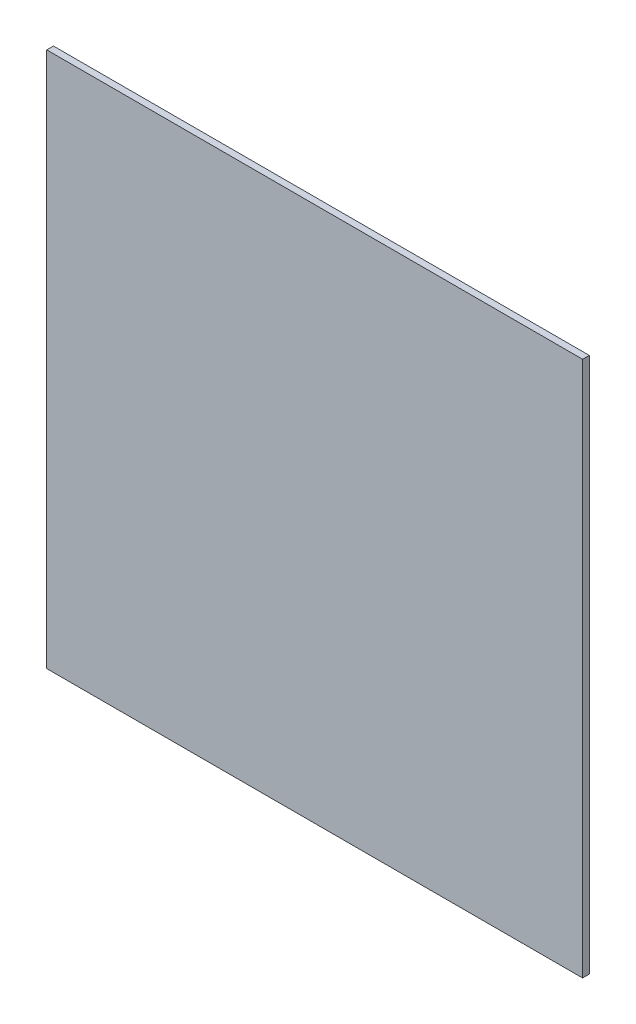
ISO-10303-21;
HEADER;
FILE_DESCRIPTION(('STEP AP214'),'2;1');
FILE_NAME('part.step','',(''),(''),'','','');
FILE_SCHEMA(('AUTOMOTIVE_DESIGN { 1 0 10303 214 1 1 1 1 }'));
ENDSEC;
DATA;
#1=APPLICATION_CONTEXT('core data for automotive mechanical design processes');
#2=APPLICATION_PROTOCOL_DEFINITION('international standard','automotive_design',2000,#1);
#3=PRODUCT_CONTEXT('',#1,'mechanical');
#4=PRODUCT('Part','Part','',(#3));
#5=PRODUCT_RELATED_PRODUCT_CATEGORY('part','',(#4));
#6=PRODUCT_DEFINITION_FORMATION('','',#4);
#7=PRODUCT_DEFINITION_CONTEXT('part definition',#1,'design');
#8=PRODUCT_DEFINITION('design','',#6,#7);
#9=PRODUCT_DEFINITION_SHAPE('','',#8);
#10=(LENGTH_UNIT() NAMED_UNIT(*) SI_UNIT(.MILLI.,.METRE.));
#11=(NAMED_UNIT(*) PLANE_ANGLE_UNIT() SI_UNIT($,.RADIAN.));
#12=(NAMED_UNIT(*) SI_UNIT($,.STERADIAN.) SOLID_ANGLE_UNIT());
#13=UNCERTAINTY_MEASURE_WITH_UNIT(LENGTH_MEASURE(1.E-05),#10,'distance_accuracy_value','');
#14=(GEOMETRIC_REPRESENTATION_CONTEXT(3) GLOBAL_UNCERTAINTY_ASSIGNED_CONTEXT((#13)) GLOBAL_UNIT_ASSIGNED_CONTEXT((#10,
#11,#12)) REPRESENTATION_CONTEXT('',''));
#15=CARTESIAN_POINT('',(0.,0.,0.));
#16=DIRECTION('',(0.,0.,1.));
#17=DIRECTION('',(1.,0.,0.));
#18=AXIS2_PLACEMENT_3D('',#15,#16,#17);
#19=CARTESIAN_POINT('',(0.,0.,-5.));
#20=DIRECTION('',(-1.,0.,0.));
#21=DIRECTION('',(0.,0.,1.));
#22=AXIS2_PLACEMENT_3D('',#19,#20,#21);
#23=PLANE('',#22);
#24=DIRECTION('',(0.,-1.,0.));
#25=VECTOR('',#24,1.);
#26=CARTESIAN_POINT('',(0.,0.,0.));
#27=LINE('',#26,#25);
#28=CARTESIAN_POINT('',(0.,400.,0.));
#29=VERTEX_POINT('',#28);
#30=CARTESIAN_POINT('',(0.,0.,0.));
#31=VERTEX_POINT('',#30);
#32=EDGE_CURVE('E97',#29,#31,#27,.T.);
#33=ORIENTED_EDGE('',*,*,#32,.F.);
#34=DIRECTION('',(0.,0.,1.));
#35=VECTOR('',#34,1.);
#36=CARTESIAN_POINT('',(0.,400.,-5.));
#37=LINE('',#36,#35);
#38=CARTESIAN_POINT('',(0.,400.,-5.));
#39=VERTEX_POINT('',#38);
#40=EDGE_CURVE('E11',#39,#29,#37,.T.);
#41=ORIENTED_EDGE('',*,*,#40,.F.);
#42=DIRECTION('',(0.,-1.,0.));
#43=VECTOR('',#42,1.);
#44=CARTESIAN_POINT('',(0.,0.,-5.));
#45=LINE('',#44,#43);
#46=CARTESIAN_POINT('',(0.,0.,-5.));
#47=VERTEX_POINT('',#46);
#48=EDGE_CURVE('E91',#39,#47,#45,.T.);
#49=ORIENTED_EDGE('',*,*,#48,.T.);
#50=DIRECTION('',(0.,0.,1.));
#51=VECTOR('',#50,1.);
#52=CARTESIAN_POINT('',(0.,0.,-5.));
#53=LINE('',#52,#51);
#54=EDGE_CURVE('E36',#47,#31,#53,.T.);
#55=ORIENTED_EDGE('',*,*,#54,.T.);
#56=EDGE_LOOP('',(#33,#41,#49,#55));
#57=FACE_BOUND('',#56,.T.);
#58=ADVANCED_FACE('F33',(#57),#23,.T.);
#59=CARTESIAN_POINT('',(0.,400.,-5.));
#60=DIRECTION('',(0.,1.,0.));
#61=DIRECTION('',(0.,0.,1.));
#62=AXIS2_PLACEMENT_3D('',#59,#60,#61);
#63=PLANE('',#62);
#64=DIRECTION('',(-1.,0.,0.));
#65=VECTOR('',#64,1.);
#66=CARTESIAN_POINT('',(0.,400.,0.));
#67=LINE('',#66,#65);
#68=CARTESIAN_POINT('',(400.,400.,0.));
#69=VERTEX_POINT('',#68);
#70=EDGE_CURVE('E93',#69,#29,#67,.T.);
#71=ORIENTED_EDGE('',*,*,#70,.F.);
#72=DIRECTION('',(0.,0.,1.));
#73=VECTOR('',#72,1.);
#74=CARTESIAN_POINT('',(400.,400.,-5.));
#75=LINE('',#74,#73);
#76=CARTESIAN_POINT('',(400.,400.,-5.));
#77=VERTEX_POINT('',#76);
#78=EDGE_CURVE('E42',#77,#69,#75,.T.);
#79=ORIENTED_EDGE('',*,*,#78,.F.);
#80=DIRECTION('',(-1.,0.,0.));
#81=VECTOR('',#80,1.);
#82=CARTESIAN_POINT('',(0.,400.,-5.));
#83=LINE('',#82,#81);
#84=EDGE_CURVE('E88',#77,#39,#83,.T.);
#85=ORIENTED_EDGE('',*,*,#84,.T.);
#86=ORIENTED_EDGE('',*,*,#40,.T.);
#87=EDGE_LOOP('',(#71,#79,#85,#86));
#88=FACE_BOUND('',#87,.T.);
#89=ADVANCED_FACE('F107',(#88),#63,.T.);
#90=CARTESIAN_POINT('',(400.,0.,-5.));
#91=DIRECTION('',(1.,0.,0.));
#92=DIRECTION('',(0.,0.,-1.));
#93=AXIS2_PLACEMENT_3D('',#90,#91,#92);
#94=PLANE('',#93);
#95=DIRECTION('',(0.,1.,0.));
#96=VECTOR('',#95,1.);
#97=CARTESIAN_POINT('',(400.,0.,0.));
#98=LINE('',#97,#96);
#99=CARTESIAN_POINT('',(400.,0.,0.));
#100=VERTEX_POINT('',#99);
#101=EDGE_CURVE('E83',#100,#69,#98,.T.);
#102=ORIENTED_EDGE('',*,*,#101,.F.);
#103=DIRECTION('',(0.,0.,1.));
#104=VECTOR('',#103,1.);
#105=CARTESIAN_POINT('',(400.,0.,-5.));
#106=LINE('',#105,#104);
#107=CARTESIAN_POINT('',(400.,0.,-5.));
#108=VERTEX_POINT('',#107);
#109=EDGE_CURVE('E78',#108,#100,#106,.T.);
#110=ORIENTED_EDGE('',*,*,#109,.F.);
#111=DIRECTION('',(0.,1.,0.));
#112=VECTOR('',#111,1.);
#113=CARTESIAN_POINT('',(400.,0.,-5.));
#114=LINE('',#113,#112);
#115=EDGE_CURVE('E81',#108,#77,#114,.T.);
#116=ORIENTED_EDGE('',*,*,#115,.T.);
#117=ORIENTED_EDGE('',*,*,#78,.T.);
#118=EDGE_LOOP('',(#102,#110,#116,#117));
#119=FACE_BOUND('',#118,.T.);
#120=ADVANCED_FACE('F80',(#119),#94,.T.);
#121=CARTESIAN_POINT('',(0.,0.,-5.));
#122=DIRECTION('',(0.,-1.,0.));
#123=DIRECTION('',(0.,0.,-1.));
#124=AXIS2_PLACEMENT_3D('',#121,#122,#123);
#125=PLANE('',#124);
#126=DIRECTION('',(1.,0.,0.));
#127=VECTOR('',#126,1.);
#128=CARTESIAN_POINT('',(0.,0.,0.));
#129=LINE('',#128,#127);
#130=EDGE_CURVE('E100',#31,#100,#129,.T.);
#131=ORIENTED_EDGE('',*,*,#130,.F.);
#132=ORIENTED_EDGE('',*,*,#54,.F.);
#133=DIRECTION('',(1.,0.,0.));
#134=VECTOR('',#133,1.);
#135=CARTESIAN_POINT('',(0.,0.,-5.));
#136=LINE('',#135,#134);
#137=EDGE_CURVE('E87',#47,#108,#136,.T.);
#138=ORIENTED_EDGE('',*,*,#137,.T.);
#139=ORIENTED_EDGE('',*,*,#109,.T.);
#140=EDGE_LOOP('',(#131,#132,#138,#139));
#141=FACE_BOUND('',#140,.T.);
#142=ADVANCED_FACE('F90',(#141),#125,.T.);
#143=CARTESIAN_POINT('',(0.,0.,-5.));
#144=DIRECTION('',(0.,0.,-1.));
#145=DIRECTION('',(-1.,0.,0.));
#146=AXIS2_PLACEMENT_3D('',#143,#144,#145);
#147=PLANE('',#146);
#148=ORIENTED_EDGE('',*,*,#48,.F.);
#149=ORIENTED_EDGE('',*,*,#84,.F.);
#150=ORIENTED_EDGE('',*,*,#115,.F.);
#151=ORIENTED_EDGE('',*,*,#137,.F.);
#152=EDGE_LOOP('',(#148,#149,#150,#151));
#153=FACE_BOUND('',#152,.T.);
#154=ADVANCED_FACE('F86',(#153),#147,.T.);
#155=CARTESIAN_POINT('',(0.,0.,0.));
#156=DIRECTION('',(0.,0.,-1.));
#157=DIRECTION('',(-1.,0.,0.));
#158=AXIS2_PLACEMENT_3D('',#155,#156,#157);
#159=PLANE('',#158);
#160=ORIENTED_EDGE('',*,*,#32,.T.);
#161=ORIENTED_EDGE('',*,*,#130,.T.);
#162=ORIENTED_EDGE('',*,*,#101,.T.);
#163=ORIENTED_EDGE('',*,*,#70,.T.);
#164=EDGE_LOOP('',(#160,#161,#162,#163));
#165=FACE_BOUND('',#164,.T.);
#166=ADVANCED_FACE('F106',(#165),#159,.F.);
#167=CLOSED_SHELL('',(#58,#89,#120,#142,#154,#166));
#168=MANIFOLD_SOLID_BREP('B2',#167);
#169=ADVANCED_BREP_SHAPE_REPRESENTATION('',(#18,#168),#14);
#170=SHAPE_DEFINITION_REPRESENTATION(#9,#169);
ENDSEC;
END-ISO-10303-21;
